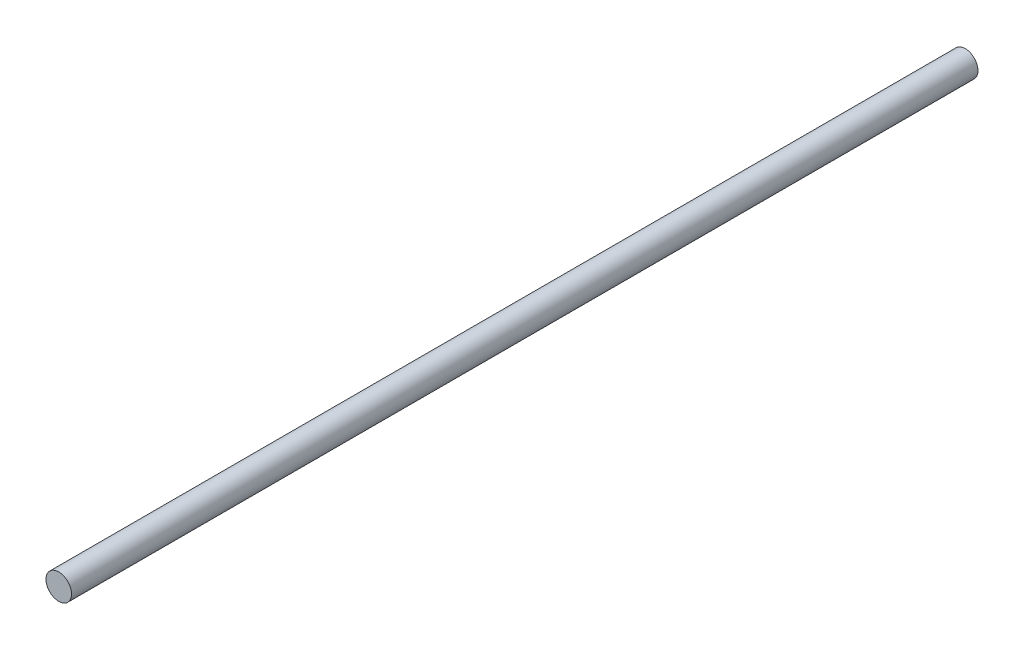
ISO-10303-21;
HEADER;
FILE_DESCRIPTION(('STEP AP214'),'2;1');
FILE_NAME('part.step','',(''),(''),'','','');
FILE_SCHEMA(('AUTOMOTIVE_DESIGN { 1 0 10303 214 1 1 1 1 }'));
ENDSEC;
DATA;
#1=APPLICATION_CONTEXT('core data for automotive mechanical design processes');
#2=APPLICATION_PROTOCOL_DEFINITION('international standard','automotive_design',2000,#1);
#3=PRODUCT_CONTEXT('',#1,'mechanical');
#4=PRODUCT('Part','Part','',(#3));
#5=PRODUCT_RELATED_PRODUCT_CATEGORY('part','',(#4));
#6=PRODUCT_DEFINITION_FORMATION('','',#4);
#7=PRODUCT_DEFINITION_CONTEXT('part definition',#1,'design');
#8=PRODUCT_DEFINITION('design','',#6,#7);
#9=PRODUCT_DEFINITION_SHAPE('','',#8);
#10=(LENGTH_UNIT() NAMED_UNIT(*) SI_UNIT(.MILLI.,.METRE.));
#11=(NAMED_UNIT(*) PLANE_ANGLE_UNIT() SI_UNIT($,.RADIAN.));
#12=(NAMED_UNIT(*) SI_UNIT($,.STERADIAN.) SOLID_ANGLE_UNIT());
#13=UNCERTAINTY_MEASURE_WITH_UNIT(LENGTH_MEASURE(1.E-05),#10,'distance_accuracy_value','');
#14=(GEOMETRIC_REPRESENTATION_CONTEXT(3) GLOBAL_UNCERTAINTY_ASSIGNED_CONTEXT((#13)) GLOBAL_UNIT_ASSIGNED_CONTEXT((#10,
#11,#12)) REPRESENTATION_CONTEXT('',''));
#15=CARTESIAN_POINT('',(0.,0.,0.));
#16=DIRECTION('',(0.,0.,1.));
#17=DIRECTION('',(1.,0.,0.));
#18=AXIS2_PLACEMENT_3D('',#15,#16,#17);
#19=CARTESIAN_POINT('',(0.,0.,279.4));
#20=DIRECTION('',(0.,0.,-1.));
#21=DIRECTION('',(-1.,0.,0.));
#22=AXIS2_PLACEMENT_3D('',#19,#20,#21);
#23=CYLINDRICAL_SURFACE('',#22,3.937);
#24=CARTESIAN_POINT('',(0.,0.,279.4));
#25=DIRECTION('',(0.,0.,1.));
#26=DIRECTION('',(1.,0.,0.));
#27=AXIS2_PLACEMENT_3D('',#24,#25,#26);
#28=CIRCLE('',#27,3.937);
#29=CARTESIAN_POINT('',(3.937,0.,279.4));
#30=VERTEX_POINT('',#29);
#31=EDGE_CURVE('E10',#30,#30,#28,.T.);
#32=ORIENTED_EDGE('',*,*,#31,.F.);
#33=EDGE_LOOP('',(#32));
#34=FACE_BOUND('',#33,.T.);
#35=CARTESIAN_POINT('',(0.,0.,0.));
#36=DIRECTION('',(0.,0.,1.));
#37=DIRECTION('',(1.,0.,0.));
#38=AXIS2_PLACEMENT_3D('',#35,#36,#37);
#39=CIRCLE('',#38,3.937);
#40=CARTESIAN_POINT('',(3.937,0.,0.));
#41=VERTEX_POINT('',#40);
#42=EDGE_CURVE('E34',#41,#41,#39,.T.);
#43=ORIENTED_EDGE('',*,*,#42,.T.);
#44=EDGE_LOOP('',(#43));
#45=FACE_BOUND('',#44,.T.);
#46=ADVANCED_FACE('F31',(#34,#45),#23,.T.);
#47=CARTESIAN_POINT('',(0.,0.,279.4));
#48=DIRECTION('',(0.,0.,1.));
#49=DIRECTION('',(1.,0.,0.));
#50=AXIS2_PLACEMENT_3D('',#47,#48,#49);
#51=PLANE('',#50);
#52=ORIENTED_EDGE('',*,*,#31,.T.);
#53=EDGE_LOOP('',(#52));
#54=FACE_BOUND('',#53,.T.);
#55=ADVANCED_FACE('F46',(#54),#51,.T.);
#56=CARTESIAN_POINT('',(0.,0.,0.));
#57=DIRECTION('',(0.,0.,1.));
#58=DIRECTION('',(1.,0.,0.));
#59=AXIS2_PLACEMENT_3D('',#56,#57,#58);
#60=PLANE('',#59);
#61=ORIENTED_EDGE('',*,*,#42,.F.);
#62=EDGE_LOOP('',(#61));
#63=FACE_BOUND('',#62,.T.);
#64=ADVANCED_FACE('F44',(#63),#60,.F.);
#65=CLOSED_SHELL('',(#46,#55,#64));
#66=MANIFOLD_SOLID_BREP('B2',#65);
#67=ADVANCED_BREP_SHAPE_REPRESENTATION('',(#18,#66),#14);
#68=SHAPE_DEFINITION_REPRESENTATION(#9,#67);
ENDSEC;
END-ISO-10303-21;
